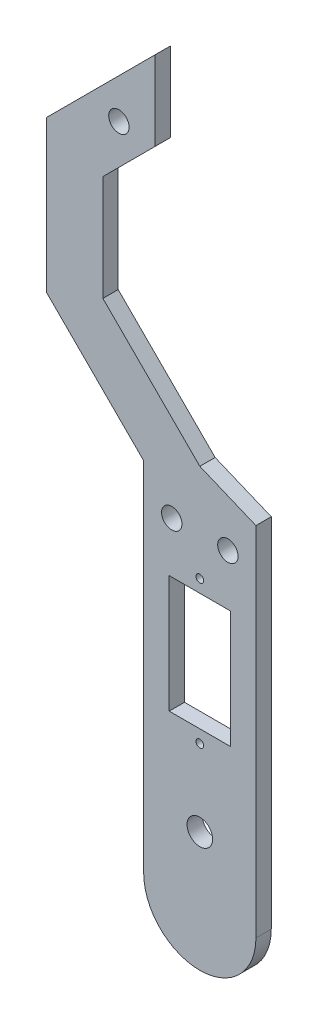
ISO-10303-21;
HEADER;
FILE_DESCRIPTION(('STEP AP214'),'2;1');
FILE_NAME('part.step','',(''),(''),'','','');
FILE_SCHEMA(('AUTOMOTIVE_DESIGN { 1 0 10303 214 1 1 1 1 }'));
ENDSEC;
DATA;
#1=APPLICATION_CONTEXT('core data for automotive mechanical design processes');
#2=APPLICATION_PROTOCOL_DEFINITION('international standard','automotive_design',2000,#1);
#3=PRODUCT_CONTEXT('',#1,'mechanical');
#4=PRODUCT('Part','Part','',(#3));
#5=PRODUCT_RELATED_PRODUCT_CATEGORY('part','',(#4));
#6=PRODUCT_DEFINITION_FORMATION('','',#4);
#7=PRODUCT_DEFINITION_CONTEXT('part definition',#1,'design');
#8=PRODUCT_DEFINITION('design','',#6,#7);
#9=PRODUCT_DEFINITION_SHAPE('','',#8);
#10=(LENGTH_UNIT() NAMED_UNIT(*) SI_UNIT(.MILLI.,.METRE.));
#11=(NAMED_UNIT(*) PLANE_ANGLE_UNIT() SI_UNIT($,.RADIAN.));
#12=(NAMED_UNIT(*) SI_UNIT($,.STERADIAN.) SOLID_ANGLE_UNIT());
#13=UNCERTAINTY_MEASURE_WITH_UNIT(LENGTH_MEASURE(1.E-05),#10,'distance_accuracy_value','');
#14=(GEOMETRIC_REPRESENTATION_CONTEXT(3) GLOBAL_UNCERTAINTY_ASSIGNED_CONTEXT((#13)) GLOBAL_UNIT_ASSIGNED_CONTEXT((#10,
#11,#12)) REPRESENTATION_CONTEXT('',''));
#15=CARTESIAN_POINT('',(0.,0.,0.));
#16=DIRECTION('',(0.,0.,1.));
#17=DIRECTION('',(1.,0.,0.));
#18=AXIS2_PLACEMENT_3D('',#15,#16,#17);
#19=CARTESIAN_POINT('',(11.,0.,3.));
#20=DIRECTION('',(0.,0.,1.));
#21=DIRECTION('',(1.,0.,0.));
#22=AXIS2_PLACEMENT_3D('',#19,#20,#21);
#23=PLANE('',#22);
#24=CARTESIAN_POINT('',(11.,12.5,3.));
#25=DIRECTION('',(0.,0.,1.));
#26=DIRECTION('',(1.,0.,0.));
#27=AXIS2_PLACEMENT_3D('',#24,#25,#26);
#28=CIRCLE('',#27,2.5);
#29=CARTESIAN_POINT('',(13.5,12.5,3.));
#30=VERTEX_POINT('',#29);
#31=EDGE_CURVE('E470',#30,#30,#28,.T.);
#32=ORIENTED_EDGE('',*,*,#31,.F.);
#33=EDGE_LOOP('',(#32));
#34=FACE_BOUND('',#33,.T.);
#35=CARTESIAN_POINT('',(11.,27.5,3.));
#36=DIRECTION('',(0.,0.,1.));
#37=DIRECTION('',(1.,0.,0.));
#38=AXIS2_PLACEMENT_3D('',#35,#36,#37);
#39=CIRCLE('',#38,0.75);
#40=CARTESIAN_POINT('',(11.75,27.5,3.));
#41=VERTEX_POINT('',#40);
#42=EDGE_CURVE('E479',#41,#41,#39,.T.);
#43=ORIENTED_EDGE('',*,*,#42,.F.);
#44=EDGE_LOOP('',(#43));
#45=FACE_BOUND('',#44,.T.);
#46=CARTESIAN_POINT('',(11.,55.5,3.));
#47=DIRECTION('',(0.,0.,1.));
#48=DIRECTION('',(1.,0.,0.));
#49=AXIS2_PLACEMENT_3D('',#46,#47,#48);
#50=CIRCLE('',#49,0.75);
#51=CARTESIAN_POINT('',(11.75,55.5,3.));
#52=VERTEX_POINT('',#51);
#53=EDGE_CURVE('E190',#52,#52,#50,.T.);
#54=ORIENTED_EDGE('',*,*,#53,.F.);
#55=EDGE_LOOP('',(#54));
#56=FACE_BOUND('',#55,.T.);
#57=DIRECTION('',(1.,0.,0.));
#58=VECTOR('',#57,1.);
#59=CARTESIAN_POINT('',(5.,53.,3.));
#60=LINE('',#59,#58);
#61=CARTESIAN_POINT('',(5.,53.,3.));
#62=VERTEX_POINT('',#61);
#63=CARTESIAN_POINT('',(17.,53.,3.));
#64=VERTEX_POINT('',#63);
#65=EDGE_CURVE('E157',#62,#64,#60,.T.);
#66=ORIENTED_EDGE('',*,*,#65,.T.);
#67=DIRECTION('',(0.,-1.,0.));
#68=VECTOR('',#67,1.);
#69=CARTESIAN_POINT('',(17.,53.,3.));
#70=LINE('',#69,#68);
#71=CARTESIAN_POINT('',(17.,30.,3.));
#72=VERTEX_POINT('',#71);
#73=EDGE_CURVE('E164',#64,#72,#70,.T.);
#74=ORIENTED_EDGE('',*,*,#73,.T.);
#75=DIRECTION('',(1.,0.,0.));
#76=VECTOR('',#75,1.);
#77=CARTESIAN_POINT('',(5.,30.,3.));
#78=LINE('',#77,#76);
#79=CARTESIAN_POINT('',(5.,30.,3.));
#80=VERTEX_POINT('',#79);
#81=EDGE_CURVE('E169',#80,#72,#78,.T.);
#82=ORIENTED_EDGE('',*,*,#81,.F.);
#83=DIRECTION('',(0.,-1.,0.));
#84=VECTOR('',#83,1.);
#85=CARTESIAN_POINT('',(5.,53.,3.));
#86=LINE('',#85,#84);
#87=EDGE_CURVE('E161',#62,#80,#86,.T.);
#88=ORIENTED_EDGE('',*,*,#87,.F.);
#89=EDGE_LOOP('',(#66,#74,#82,#88));
#90=FACE_BOUND('',#89,.T.);
#91=CARTESIAN_POINT('',(-4.85786437626912,125.150757595082,3.));
#92=DIRECTION('',(0.,0.,1.));
#93=DIRECTION('',(1.,0.,0.));
#94=AXIS2_PLACEMENT_3D('',#91,#92,#93);
#95=CIRCLE('',#94,2.00000000000002);
#96=CARTESIAN_POINT('',(-2.8578643762691,125.150757595082,3.));
#97=VERTEX_POINT('',#96);
#98=EDGE_CURVE('E205',#97,#97,#95,.T.);
#99=ORIENTED_EDGE('',*,*,#98,.F.);
#100=EDGE_LOOP('',(#99));
#101=FACE_BOUND('',#100,.T.);
#102=CARTESIAN_POINT('',(11.,0.,3.));
#103=DIRECTION('',(0.,0.,1.));
#104=DIRECTION('',(1.,0.,0.));
#105=AXIS2_PLACEMENT_3D('',#102,#103,#104);
#106=CIRCLE('',#105,11.);
#107=CARTESIAN_POINT('',(0.,0.,3.));
#108=VERTEX_POINT('',#107);
#109=CARTESIAN_POINT('',(22.,0.,3.));
#110=VERTEX_POINT('',#109);
#111=EDGE_CURVE('E221',#108,#110,#106,.T.);
#112=ORIENTED_EDGE('',*,*,#111,.T.);
#113=DIRECTION('',(0.,1.,0.));
#114=VECTOR('',#113,1.);
#115=CARTESIAN_POINT('',(22.,0.,3.));
#116=LINE('',#115,#114);
#117=CARTESIAN_POINT('',(22.,70.,3.));
#118=VERTEX_POINT('',#117);
#119=EDGE_CURVE('E225',#110,#118,#116,.T.);
#120=ORIENTED_EDGE('',*,*,#119,.T.);
#121=DIRECTION('',(0.923879532511286,-0.382683432365092,0.));
#122=VECTOR('',#121,1.);
#123=CARTESIAN_POINT('',(11.,74.5563491861041,3.));
#124=LINE('',#123,#122);
#125=CARTESIAN_POINT('',(11.,74.5563491861041,3.));
#126=VERTEX_POINT('',#125);
#127=EDGE_CURVE('E229',#126,#118,#124,.T.);
#128=ORIENTED_EDGE('',*,*,#127,.F.);
#129=DIRECTION('',(-0.707106781186552,0.707106781186543,0.));
#130=VECTOR('',#129,1.);
#131=CARTESIAN_POINT('',(11.,74.5563491861041,3.));
#132=LINE('',#131,#130);
#133=CARTESIAN_POINT('',(-7.99999999999999,93.5563491861038,3.));
#134=VERTEX_POINT('',#133);
#135=EDGE_CURVE('E233',#126,#134,#132,.T.);
#136=ORIENTED_EDGE('',*,*,#135,.T.);
#137=DIRECTION('',(0.,1.,0.));
#138=VECTOR('',#137,1.);
#139=CARTESIAN_POINT('',(-7.99999999999999,93.5563491861038,3.));
#140=LINE('',#139,#138);
#141=CARTESIAN_POINT('',(-7.99999999999999,114.230447378299,3.));
#142=VERTEX_POINT('',#141);
#143=EDGE_CURVE('E236',#134,#142,#140,.T.);
#144=ORIENTED_EDGE('',*,*,#143,.T.);
#145=DIRECTION('',(-0.707106781186543,-0.707106781186552,0.));
#146=VECTOR('',#145,1.);
#147=CARTESIAN_POINT('',(2.21320343559631,124.443650813896,3.));
#148=LINE('',#147,#146);
#149=CARTESIAN_POINT('',(2.21320343559631,124.443650813896,3.));
#150=VERTEX_POINT('',#149);
#151=EDGE_CURVE('E239',#150,#142,#148,.T.);
#152=ORIENTED_EDGE('',*,*,#151,.F.);
#153=DIRECTION('',(0.,-1.,0.));
#154=VECTOR('',#153,1.);
#155=CARTESIAN_POINT('',(2.21320343559631,140.,3.));
#156=LINE('',#155,#154);
#157=CARTESIAN_POINT('',(2.21320343559631,140.,3.));
#158=VERTEX_POINT('',#157);
#159=EDGE_CURVE('E243',#158,#150,#156,.T.);
#160=ORIENTED_EDGE('',*,*,#159,.F.);
#161=DIRECTION('',(0.707106781186543,0.707106781186552,0.));
#162=VECTOR('',#161,1.);
#163=CARTESIAN_POINT('',(-19.,118.786796564403,3.));
#164=LINE('',#163,#162);
#165=CARTESIAN_POINT('',(-19.,118.786796564403,3.));
#166=VERTEX_POINT('',#165);
#167=EDGE_CURVE('E247',#166,#158,#164,.T.);
#168=ORIENTED_EDGE('',*,*,#167,.F.);
#169=DIRECTION('',(0.,1.,0.));
#170=VECTOR('',#169,1.);
#171=CARTESIAN_POINT('',(-19.,88.9999999999998,3.));
#172=LINE('',#171,#170);
#173=CARTESIAN_POINT('',(-19.,88.9999999999998,3.));
#174=VERTEX_POINT('',#173);
#175=EDGE_CURVE('E251',#174,#166,#172,.T.);
#176=ORIENTED_EDGE('',*,*,#175,.F.);
#177=DIRECTION('',(-0.707106781186552,0.707106781186543,0.));
#178=VECTOR('',#177,1.);
#179=CARTESIAN_POINT('',(0.,70.,3.));
#180=LINE('',#179,#178);
#181=CARTESIAN_POINT('',(0.,70.,3.));
#182=VERTEX_POINT('',#181);
#183=EDGE_CURVE('E255',#182,#174,#180,.T.);
#184=ORIENTED_EDGE('',*,*,#183,.F.);
#185=DIRECTION('',(0.,1.,0.));
#186=VECTOR('',#185,1.);
#187=CARTESIAN_POINT('',(0.,0.,3.));
#188=LINE('',#187,#186);
#189=EDGE_CURVE('E259',#108,#182,#188,.T.);
#190=ORIENTED_EDGE('',*,*,#189,.F.);
#191=EDGE_LOOP('',(#112,#120,#128,#136,#144,#152,#160,#168,#176,#184,#190));
#192=FACE_BOUND('',#191,.T.);
#193=CARTESIAN_POINT('',(16.5,63.,3.));
#194=DIRECTION('',(0.,0.,1.));
#195=DIRECTION('',(1.,0.,0.));
#196=AXIS2_PLACEMENT_3D('',#193,#194,#195);
#197=CIRCLE('',#196,2.);
#198=CARTESIAN_POINT('',(18.5,63.,3.));
#199=VERTEX_POINT('',#198);
#200=EDGE_CURVE('E209',#199,#199,#197,.T.);
#201=ORIENTED_EDGE('',*,*,#200,.F.);
#202=EDGE_LOOP('',(#201));
#203=FACE_BOUND('',#202,.T.);
#204=CARTESIAN_POINT('',(5.5,63.,3.));
#205=DIRECTION('',(0.,0.,-1.));
#206=DIRECTION('',(-1.,0.,0.));
#207=AXIS2_PLACEMENT_3D('',#204,#205,#206);
#208=CIRCLE('',#207,2.);
#209=CARTESIAN_POINT('',(3.5,63.,3.));
#210=VERTEX_POINT('',#209);
#211=EDGE_CURVE('E213',#210,#210,#208,.T.);
#212=ORIENTED_EDGE('',*,*,#211,.T.);
#213=EDGE_LOOP('',(#212));
#214=FACE_BOUND('',#213,.T.);
#215=ADVANCED_FACE('F45',(#34,#45,#56,#90,#101,#192,#203,#214),#23,.T.);
#216=CARTESIAN_POINT('',(11.,0.,0.));
#217=DIRECTION('',(0.,0.,1.));
#218=DIRECTION('',(1.,0.,0.));
#219=AXIS2_PLACEMENT_3D('',#216,#217,#218);
#220=PLANE('',#219);
#221=CARTESIAN_POINT('',(11.,12.5,0.));
#222=DIRECTION('',(0.,0.,1.));
#223=DIRECTION('',(1.,0.,0.));
#224=AXIS2_PLACEMENT_3D('',#221,#222,#223);
#225=CIRCLE('',#224,2.5);
#226=CARTESIAN_POINT('',(13.5,12.5,0.));
#227=VERTEX_POINT('',#226);
#228=EDGE_CURVE('E472',#227,#227,#225,.T.);
#229=ORIENTED_EDGE('',*,*,#228,.T.);
#230=EDGE_LOOP('',(#229));
#231=FACE_BOUND('',#230,.T.);
#232=CARTESIAN_POINT('',(11.,27.5,0.));
#233=DIRECTION('',(0.,0.,1.));
#234=DIRECTION('',(1.,0.,0.));
#235=AXIS2_PLACEMENT_3D('',#232,#233,#234);
#236=CIRCLE('',#235,0.75);
#237=CARTESIAN_POINT('',(11.75,27.5,0.));
#238=VERTEX_POINT('',#237);
#239=EDGE_CURVE('E476',#238,#238,#236,.T.);
#240=ORIENTED_EDGE('',*,*,#239,.T.);
#241=EDGE_LOOP('',(#240));
#242=FACE_BOUND('',#241,.T.);
#243=CARTESIAN_POINT('',(11.,55.5,0.));
#244=DIRECTION('',(0.,0.,1.));
#245=DIRECTION('',(1.,0.,0.));
#246=AXIS2_PLACEMENT_3D('',#243,#244,#245);
#247=CIRCLE('',#246,0.75);
#248=CARTESIAN_POINT('',(11.75,55.5,0.));
#249=VERTEX_POINT('',#248);
#250=EDGE_CURVE('E180',#249,#249,#247,.T.);
#251=ORIENTED_EDGE('',*,*,#250,.T.);
#252=EDGE_LOOP('',(#251));
#253=FACE_BOUND('',#252,.T.);
#254=DIRECTION('',(0.,-1.,0.));
#255=VECTOR('',#254,1.);
#256=CARTESIAN_POINT('',(17.,53.,0.));
#257=LINE('',#256,#255);
#258=CARTESIAN_POINT('',(17.,53.,0.));
#259=VERTEX_POINT('',#258);
#260=CARTESIAN_POINT('',(17.,30.,0.));
#261=VERTEX_POINT('',#260);
#262=EDGE_CURVE('E189',#259,#261,#257,.T.);
#263=ORIENTED_EDGE('',*,*,#262,.F.);
#264=DIRECTION('',(1.,0.,0.));
#265=VECTOR('',#264,1.);
#266=CARTESIAN_POINT('',(5.,53.,0.));
#267=LINE('',#266,#265);
#268=CARTESIAN_POINT('',(5.,53.,0.));
#269=VERTEX_POINT('',#268);
#270=EDGE_CURVE('E71',#269,#259,#267,.T.);
#271=ORIENTED_EDGE('',*,*,#270,.F.);
#272=DIRECTION('',(0.,-1.,0.));
#273=VECTOR('',#272,1.);
#274=CARTESIAN_POINT('',(5.,53.,0.));
#275=LINE('',#274,#273);
#276=CARTESIAN_POINT('',(5.,30.,0.));
#277=VERTEX_POINT('',#276);
#278=EDGE_CURVE('E173',#269,#277,#275,.T.);
#279=ORIENTED_EDGE('',*,*,#278,.T.);
#280=DIRECTION('',(1.,0.,0.));
#281=VECTOR('',#280,1.);
#282=CARTESIAN_POINT('',(5.,30.,0.));
#283=LINE('',#282,#281);
#284=EDGE_CURVE('E177',#277,#261,#283,.T.);
#285=ORIENTED_EDGE('',*,*,#284,.T.);
#286=EDGE_LOOP('',(#263,#271,#279,#285));
#287=FACE_BOUND('',#286,.T.);
#288=CARTESIAN_POINT('',(-4.85786437626912,125.150757595082,0.));
#289=DIRECTION('',(0.,0.,1.));
#290=DIRECTION('',(1.,0.,0.));
#291=AXIS2_PLACEMENT_3D('',#288,#289,#290);
#292=CIRCLE('',#291,2.00000000000002);
#293=CARTESIAN_POINT('',(-2.8578643762691,125.150757595082,0.));
#294=VERTEX_POINT('',#293);
#295=EDGE_CURVE('E199',#294,#294,#292,.T.);
#296=ORIENTED_EDGE('',*,*,#295,.T.);
#297=EDGE_LOOP('',(#296));
#298=FACE_BOUND('',#297,.T.);
#299=CARTESIAN_POINT('',(16.5,63.,0.));
#300=DIRECTION('',(0.,0.,1.));
#301=DIRECTION('',(1.,0.,0.));
#302=AXIS2_PLACEMENT_3D('',#299,#300,#301);
#303=CIRCLE('',#302,2.);
#304=CARTESIAN_POINT('',(18.5,63.,0.));
#305=VERTEX_POINT('',#304);
#306=EDGE_CURVE('E217',#305,#305,#303,.T.);
#307=ORIENTED_EDGE('',*,*,#306,.T.);
#308=EDGE_LOOP('',(#307));
#309=FACE_BOUND('',#308,.T.);
#310=CARTESIAN_POINT('',(11.,0.,0.));
#311=DIRECTION('',(0.,0.,1.));
#312=DIRECTION('',(1.,0.,0.));
#313=AXIS2_PLACEMENT_3D('',#310,#311,#312);
#314=CIRCLE('',#313,11.);
#315=CARTESIAN_POINT('',(0.,0.,0.));
#316=VERTEX_POINT('',#315);
#317=CARTESIAN_POINT('',(22.,0.,0.));
#318=VERTEX_POINT('',#317);
#319=EDGE_CURVE('E264',#316,#318,#314,.T.);
#320=ORIENTED_EDGE('',*,*,#319,.F.);
#321=DIRECTION('',(0.,1.,0.));
#322=VECTOR('',#321,1.);
#323=CARTESIAN_POINT('',(0.,0.,0.));
#324=LINE('',#323,#322);
#325=CARTESIAN_POINT('',(0.,70.,0.));
#326=VERTEX_POINT('',#325);
#327=EDGE_CURVE('E226',#316,#326,#324,.T.);
#328=ORIENTED_EDGE('',*,*,#327,.T.);
#329=DIRECTION('',(-0.707106781186552,0.707106781186543,0.));
#330=VECTOR('',#329,1.);
#331=CARTESIAN_POINT('',(0.,70.,0.));
#332=LINE('',#331,#330);
#333=CARTESIAN_POINT('',(-19.,88.9999999999998,0.));
#334=VERTEX_POINT('',#333);
#335=EDGE_CURVE('E299',#326,#334,#332,.T.);
#336=ORIENTED_EDGE('',*,*,#335,.T.);
#337=DIRECTION('',(0.,1.,0.));
#338=VECTOR('',#337,1.);
#339=CARTESIAN_POINT('',(-19.,88.9999999999998,0.));
#340=LINE('',#339,#338);
#341=CARTESIAN_POINT('',(-19.,118.786796564403,0.));
#342=VERTEX_POINT('',#341);
#343=EDGE_CURVE('E295',#334,#342,#340,.T.);
#344=ORIENTED_EDGE('',*,*,#343,.T.);
#345=DIRECTION('',(0.707106781186543,0.707106781186552,0.));
#346=VECTOR('',#345,1.);
#347=CARTESIAN_POINT('',(-19.,118.786796564403,0.));
#348=LINE('',#347,#346);
#349=CARTESIAN_POINT('',(2.21320343559631,140.,0.));
#350=VERTEX_POINT('',#349);
#351=EDGE_CURVE('E291',#342,#350,#348,.T.);
#352=ORIENTED_EDGE('',*,*,#351,.T.);
#353=DIRECTION('',(0.,-1.,0.));
#354=VECTOR('',#353,1.);
#355=CARTESIAN_POINT('',(2.21320343559631,140.,0.));
#356=LINE('',#355,#354);
#357=CARTESIAN_POINT('',(2.21320343559631,124.443650813896,0.));
#358=VERTEX_POINT('',#357);
#359=EDGE_CURVE('E287',#350,#358,#356,.T.);
#360=ORIENTED_EDGE('',*,*,#359,.T.);
#361=DIRECTION('',(-0.707106781186543,-0.707106781186552,0.));
#362=VECTOR('',#361,1.);
#363=CARTESIAN_POINT('',(2.21320343559631,124.443650813896,0.));
#364=LINE('',#363,#362);
#365=CARTESIAN_POINT('',(-7.99999999999999,114.230447378299,0.));
#366=VERTEX_POINT('',#365);
#367=EDGE_CURVE('E283',#358,#366,#364,.T.);
#368=ORIENTED_EDGE('',*,*,#367,.T.);
#369=DIRECTION('',(0.,1.,0.));
#370=VECTOR('',#369,1.);
#371=CARTESIAN_POINT('',(-7.99999999999999,93.5563491861038,0.));
#372=LINE('',#371,#370);
#373=CARTESIAN_POINT('',(-7.99999999999999,93.5563491861038,0.));
#374=VERTEX_POINT('',#373);
#375=EDGE_CURVE('E279',#374,#366,#372,.T.);
#376=ORIENTED_EDGE('',*,*,#375,.F.);
#377=DIRECTION('',(-0.707106781186552,0.707106781186543,0.));
#378=VECTOR('',#377,1.);
#379=CARTESIAN_POINT('',(11.,74.5563491861041,0.));
#380=LINE('',#379,#378);
#381=CARTESIAN_POINT('',(11.,74.5563491861041,0.));
#382=VERTEX_POINT('',#381);
#383=EDGE_CURVE('E276',#382,#374,#380,.T.);
#384=ORIENTED_EDGE('',*,*,#383,.F.);
#385=DIRECTION('',(0.923879532511286,-0.382683432365092,0.));
#386=VECTOR('',#385,1.);
#387=CARTESIAN_POINT('',(11.,74.5563491861041,0.));
#388=LINE('',#387,#386);
#389=CARTESIAN_POINT('',(22.,70.,0.));
#390=VERTEX_POINT('',#389);
#391=EDGE_CURVE('E272',#382,#390,#388,.T.);
#392=ORIENTED_EDGE('',*,*,#391,.T.);
#393=DIRECTION('',(0.,1.,0.));
#394=VECTOR('',#393,1.);
#395=CARTESIAN_POINT('',(22.,0.,0.));
#396=LINE('',#395,#394);
#397=EDGE_CURVE('E268',#318,#390,#396,.T.);
#398=ORIENTED_EDGE('',*,*,#397,.F.);
#399=EDGE_LOOP('',(#320,#328,#336,#344,#352,#360,#368,#376,#384,#392,#398));
#400=FACE_BOUND('',#399,.T.);
#401=CARTESIAN_POINT('',(5.5,63.,0.));
#402=DIRECTION('',(0.,0.,1.));
#403=DIRECTION('',(1.,0.,0.));
#404=AXIS2_PLACEMENT_3D('',#401,#402,#403);
#405=CIRCLE('',#404,2.);
#406=CARTESIAN_POINT('',(7.5,63.,0.));
#407=VERTEX_POINT('',#406);
#408=EDGE_CURVE('E49',#407,#407,#405,.F.);
#409=ORIENTED_EDGE('',*,*,#408,.F.);
#410=EDGE_LOOP('',(#409));
#411=FACE_BOUND('',#410,.T.);
#412=ADVANCED_FACE('F344',(#231,#242,#253,#287,#298,#309,#400,#411),#220,.F.);
#413=CARTESIAN_POINT('',(11.,0.,3.));
#414=DIRECTION('',(0.,0.,-1.));
#415=DIRECTION('',(-1.,0.,0.));
#416=AXIS2_PLACEMENT_3D('',#413,#414,#415);
#417=CYLINDRICAL_SURFACE('',#416,11.);
#418=ORIENTED_EDGE('',*,*,#319,.T.);
#419=DIRECTION('',(0.,0.,-1.));
#420=VECTOR('',#419,1.);
#421=CARTESIAN_POINT('',(22.,0.,3.));
#422=LINE('',#421,#420);
#423=EDGE_CURVE('E11',#110,#318,#422,.T.);
#424=ORIENTED_EDGE('',*,*,#423,.F.);
#425=ORIENTED_EDGE('',*,*,#111,.F.);
#426=DIRECTION('',(0.,0.,-1.));
#427=VECTOR('',#426,1.);
#428=CARTESIAN_POINT('',(0.,0.,3.));
#429=LINE('',#428,#427);
#430=EDGE_CURVE('E263',#108,#316,#429,.T.);
#431=ORIENTED_EDGE('',*,*,#430,.T.);
#432=EDGE_LOOP('',(#418,#424,#425,#431));
#433=FACE_BOUND('',#432,.T.);
#434=ADVANCED_FACE('F47',(#433),#417,.T.);
#435=CARTESIAN_POINT('',(22.,0.,3.));
#436=DIRECTION('',(-1.,0.,0.));
#437=DIRECTION('',(0.,-1.,0.));
#438=AXIS2_PLACEMENT_3D('',#435,#436,#437);
#439=PLANE('',#438);
#440=ORIENTED_EDGE('',*,*,#397,.T.);
#441=DIRECTION('',(0.,0.,-1.));
#442=VECTOR('',#441,1.);
#443=CARTESIAN_POINT('',(22.,70.,3.));
#444=LINE('',#443,#442);
#445=EDGE_CURVE('E55',#118,#390,#444,.T.);
#446=ORIENTED_EDGE('',*,*,#445,.F.);
#447=ORIENTED_EDGE('',*,*,#119,.F.);
#448=ORIENTED_EDGE('',*,*,#423,.T.);
#449=EDGE_LOOP('',(#440,#446,#447,#448));
#450=FACE_BOUND('',#449,.T.);
#451=ADVANCED_FACE('F352',(#450),#439,.F.);
#452=CARTESIAN_POINT('',(11.,74.5563491861041,3.));
#453=DIRECTION('',(0.382683432365092,0.923879532511286,0.));
#454=DIRECTION('',(-0.923879532511286,0.382683432365092,0.));
#455=AXIS2_PLACEMENT_3D('',#452,#453,#454);
#456=PLANE('',#455);
#457=ORIENTED_EDGE('',*,*,#391,.F.);
#458=DIRECTION('',(0.,0.,-1.));
#459=VECTOR('',#458,1.);
#460=CARTESIAN_POINT('',(11.,74.5563491861041,3.));
#461=LINE('',#460,#459);
#462=EDGE_CURVE('E330',#126,#382,#461,.T.);
#463=ORIENTED_EDGE('',*,*,#462,.F.);
#464=ORIENTED_EDGE('',*,*,#127,.T.);
#465=ORIENTED_EDGE('',*,*,#445,.T.);
#466=EDGE_LOOP('',(#457,#463,#464,#465));
#467=FACE_BOUND('',#466,.T.);
#468=ADVANCED_FACE('F392',(#467),#456,.T.);
#469=CARTESIAN_POINT('',(11.,74.5563491861041,3.));
#470=DIRECTION('',(-0.707106781186543,-0.707106781186552,0.));
#471=DIRECTION('',(0.707106781186552,-0.707106781186543,0.));
#472=AXIS2_PLACEMENT_3D('',#469,#470,#471);
#473=PLANE('',#472);
#474=ORIENTED_EDGE('',*,*,#383,.T.);
#475=DIRECTION('',(0.,0.,-1.));
#476=VECTOR('',#475,1.);
#477=CARTESIAN_POINT('',(-7.99999999999999,93.5563491861038,3.));
#478=LINE('',#477,#476);
#479=EDGE_CURVE('E326',#134,#374,#478,.T.);
#480=ORIENTED_EDGE('',*,*,#479,.F.);
#481=ORIENTED_EDGE('',*,*,#135,.F.);
#482=ORIENTED_EDGE('',*,*,#462,.T.);
#483=EDGE_LOOP('',(#474,#480,#481,#482));
#484=FACE_BOUND('',#483,.T.);
#485=ADVANCED_FACE('F388',(#484),#473,.F.);
#486=CARTESIAN_POINT('',(-7.99999999999999,93.5563491861038,3.));
#487=DIRECTION('',(-1.,0.,0.));
#488=DIRECTION('',(0.,-1.,0.));
#489=AXIS2_PLACEMENT_3D('',#486,#487,#488);
#490=PLANE('',#489);
#491=ORIENTED_EDGE('',*,*,#375,.T.);
#492=DIRECTION('',(0.,0.,-1.));
#493=VECTOR('',#492,1.);
#494=CARTESIAN_POINT('',(-7.99999999999999,114.230447378299,3.));
#495=LINE('',#494,#493);
#496=EDGE_CURVE('E323',#142,#366,#495,.T.);
#497=ORIENTED_EDGE('',*,*,#496,.F.);
#498=ORIENTED_EDGE('',*,*,#143,.F.);
#499=ORIENTED_EDGE('',*,*,#479,.T.);
#500=EDGE_LOOP('',(#491,#497,#498,#499));
#501=FACE_BOUND('',#500,.T.);
#502=ADVANCED_FACE('F384',(#501),#490,.F.);
#503=CARTESIAN_POINT('',(2.21320343559631,124.443650813896,3.));
#504=DIRECTION('',(0.707106781186552,-0.707106781186543,0.));
#505=DIRECTION('',(0.707106781186543,0.707106781186552,0.));
#506=AXIS2_PLACEMENT_3D('',#503,#504,#505);
#507=PLANE('',#506);
#508=ORIENTED_EDGE('',*,*,#367,.F.);
#509=DIRECTION('',(0.,0.,-1.));
#510=VECTOR('',#509,1.);
#511=CARTESIAN_POINT('',(2.21320343559631,124.443650813896,3.));
#512=LINE('',#511,#510);
#513=EDGE_CURVE('E320',#150,#358,#512,.T.);
#514=ORIENTED_EDGE('',*,*,#513,.F.);
#515=ORIENTED_EDGE('',*,*,#151,.T.);
#516=ORIENTED_EDGE('',*,*,#496,.T.);
#517=EDGE_LOOP('',(#508,#514,#515,#516));
#518=FACE_BOUND('',#517,.T.);
#519=ADVANCED_FACE('F380',(#518),#507,.T.);
#520=CARTESIAN_POINT('',(2.21320343559631,140.,3.));
#521=DIRECTION('',(1.,0.,0.));
#522=DIRECTION('',(0.,1.,0.));
#523=AXIS2_PLACEMENT_3D('',#520,#521,#522);
#524=PLANE('',#523);
#525=ORIENTED_EDGE('',*,*,#359,.F.);
#526=DIRECTION('',(0.,0.,-1.));
#527=VECTOR('',#526,1.);
#528=CARTESIAN_POINT('',(2.21320343559631,140.,3.));
#529=LINE('',#528,#527);
#530=EDGE_CURVE('E317',#158,#350,#529,.T.);
#531=ORIENTED_EDGE('',*,*,#530,.F.);
#532=ORIENTED_EDGE('',*,*,#159,.T.);
#533=ORIENTED_EDGE('',*,*,#513,.T.);
#534=EDGE_LOOP('',(#525,#531,#532,#533));
#535=FACE_BOUND('',#534,.T.);
#536=ADVANCED_FACE('F376',(#535),#524,.T.);
#537=CARTESIAN_POINT('',(-19.,118.786796564403,3.));
#538=DIRECTION('',(-0.707106781186552,0.707106781186543,0.));
#539=DIRECTION('',(-0.707106781186543,-0.707106781186552,0.));
#540=AXIS2_PLACEMENT_3D('',#537,#538,#539);
#541=PLANE('',#540);
#542=ORIENTED_EDGE('',*,*,#351,.F.);
#543=DIRECTION('',(0.,0.,-1.));
#544=VECTOR('',#543,1.);
#545=CARTESIAN_POINT('',(-19.,118.786796564403,3.));
#546=LINE('',#545,#544);
#547=EDGE_CURVE('E314',#166,#342,#546,.T.);
#548=ORIENTED_EDGE('',*,*,#547,.F.);
#549=ORIENTED_EDGE('',*,*,#167,.T.);
#550=ORIENTED_EDGE('',*,*,#530,.T.);
#551=EDGE_LOOP('',(#542,#548,#549,#550));
#552=FACE_BOUND('',#551,.T.);
#553=ADVANCED_FACE('F372',(#552),#541,.T.);
#554=CARTESIAN_POINT('',(-19.,88.9999999999998,3.));
#555=DIRECTION('',(-1.,0.,0.));
#556=DIRECTION('',(0.,-1.,0.));
#557=AXIS2_PLACEMENT_3D('',#554,#555,#556);
#558=PLANE('',#557);
#559=ORIENTED_EDGE('',*,*,#343,.F.);
#560=DIRECTION('',(0.,0.,-1.));
#561=VECTOR('',#560,1.);
#562=CARTESIAN_POINT('',(-19.,88.9999999999998,3.));
#563=LINE('',#562,#561);
#564=EDGE_CURVE('E311',#174,#334,#563,.T.);
#565=ORIENTED_EDGE('',*,*,#564,.F.);
#566=ORIENTED_EDGE('',*,*,#175,.T.);
#567=ORIENTED_EDGE('',*,*,#547,.T.);
#568=EDGE_LOOP('',(#559,#565,#566,#567));
#569=FACE_BOUND('',#568,.T.);
#570=ADVANCED_FACE('F368',(#569),#558,.T.);
#571=CARTESIAN_POINT('',(0.,70.,3.));
#572=DIRECTION('',(-0.707106781186543,-0.707106781186552,0.));
#573=DIRECTION('',(0.707106781186552,-0.707106781186543,0.));
#574=AXIS2_PLACEMENT_3D('',#571,#572,#573);
#575=PLANE('',#574);
#576=ORIENTED_EDGE('',*,*,#335,.F.);
#577=DIRECTION('',(0.,0.,-1.));
#578=VECTOR('',#577,1.);
#579=CARTESIAN_POINT('',(0.,70.,3.));
#580=LINE('',#579,#578);
#581=EDGE_CURVE('E308',#182,#326,#580,.T.);
#582=ORIENTED_EDGE('',*,*,#581,.F.);
#583=ORIENTED_EDGE('',*,*,#183,.T.);
#584=ORIENTED_EDGE('',*,*,#564,.T.);
#585=EDGE_LOOP('',(#576,#582,#583,#584));
#586=FACE_BOUND('',#585,.T.);
#587=ADVANCED_FACE('F364',(#586),#575,.T.);
#588=CARTESIAN_POINT('',(0.,0.,3.));
#589=DIRECTION('',(-1.,0.,0.));
#590=DIRECTION('',(0.,-1.,0.));
#591=AXIS2_PLACEMENT_3D('',#588,#589,#590);
#592=PLANE('',#591);
#593=ORIENTED_EDGE('',*,*,#327,.F.);
#594=ORIENTED_EDGE('',*,*,#430,.F.);
#595=ORIENTED_EDGE('',*,*,#189,.T.);
#596=ORIENTED_EDGE('',*,*,#581,.T.);
#597=EDGE_LOOP('',(#593,#594,#595,#596));
#598=FACE_BOUND('',#597,.T.);
#599=ADVANCED_FACE('F360',(#598),#592,.T.);
#600=CARTESIAN_POINT('',(16.5,63.,-11.));
#601=DIRECTION('',(0.,0.,1.));
#602=DIRECTION('',(1.,0.,0.));
#603=AXIS2_PLACEMENT_3D('',#600,#601,#602);
#604=CYLINDRICAL_SURFACE('',#603,2.);
#605=ORIENTED_EDGE('',*,*,#200,.T.);
#606=EDGE_LOOP('',(#605));
#607=FACE_BOUND('',#606,.T.);
#608=ORIENTED_EDGE('',*,*,#306,.F.);
#609=EDGE_LOOP('',(#608));
#610=FACE_BOUND('',#609,.T.);
#611=ADVANCED_FACE('F363',(#607,#610),#604,.F.);
#612=CARTESIAN_POINT('',(5.5,63.,-11.));
#613=DIRECTION('',(0.,0.,1.));
#614=DIRECTION('',(1.,0.,0.));
#615=AXIS2_PLACEMENT_3D('',#612,#613,#614);
#616=CYLINDRICAL_SURFACE('',#615,2.);
#617=ORIENTED_EDGE('',*,*,#211,.F.);
#618=EDGE_LOOP('',(#617));
#619=FACE_BOUND('',#618,.T.);
#620=ORIENTED_EDGE('',*,*,#408,.T.);
#621=EDGE_LOOP('',(#620));
#622=FACE_BOUND('',#621,.T.);
#623=ADVANCED_FACE('F342',(#619,#622),#616,.F.);
#624=CARTESIAN_POINT('',(-4.85786437626912,125.150757595082,3.));
#625=DIRECTION('',(0.,0.,-1.));
#626=DIRECTION('',(-1.,0.,0.));
#627=AXIS2_PLACEMENT_3D('',#624,#625,#626);
#628=CYLINDRICAL_SURFACE('',#627,2.00000000000002);
#629=ORIENTED_EDGE('',*,*,#98,.T.);
#630=EDGE_LOOP('',(#629));
#631=FACE_BOUND('',#630,.T.);
#632=ORIENTED_EDGE('',*,*,#295,.F.);
#633=EDGE_LOOP('',(#632));
#634=FACE_BOUND('',#633,.T.);
#635=ADVANCED_FACE('F432',(#631,#634),#628,.F.);
#636=CARTESIAN_POINT('',(5.,53.,3.));
#637=DIRECTION('',(0.,1.,0.));
#638=DIRECTION('',(0.,0.,1.));
#639=AXIS2_PLACEMENT_3D('',#636,#637,#638);
#640=PLANE('',#639);
#641=ORIENTED_EDGE('',*,*,#270,.T.);
#642=DIRECTION('',(0.,0.,-1.));
#643=VECTOR('',#642,1.);
#644=CARTESIAN_POINT('',(17.,53.,3.));
#645=LINE('',#644,#643);
#646=EDGE_CURVE('E154',#64,#259,#645,.T.);
#647=ORIENTED_EDGE('',*,*,#646,.F.);
#648=ORIENTED_EDGE('',*,*,#65,.F.);
#649=DIRECTION('',(0.,0.,-1.));
#650=VECTOR('',#649,1.);
#651=CARTESIAN_POINT('',(5.,53.,3.));
#652=LINE('',#651,#650);
#653=EDGE_CURVE('E196',#62,#269,#652,.T.);
#654=ORIENTED_EDGE('',*,*,#653,.T.);
#655=EDGE_LOOP('',(#641,#647,#648,#654));
#656=FACE_BOUND('',#655,.T.);
#657=ADVANCED_FACE('F155',(#656),#640,.F.);
#658=CARTESIAN_POINT('',(5.,53.,3.));
#659=DIRECTION('',(1.,0.,0.));
#660=DIRECTION('',(0.,1.,0.));
#661=AXIS2_PLACEMENT_3D('',#658,#659,#660);
#662=PLANE('',#661);
#663=ORIENTED_EDGE('',*,*,#278,.F.);
#664=ORIENTED_EDGE('',*,*,#653,.F.);
#665=ORIENTED_EDGE('',*,*,#87,.T.);
#666=DIRECTION('',(0.,0.,-1.));
#667=VECTOR('',#666,1.);
#668=CARTESIAN_POINT('',(5.,30.,3.));
#669=LINE('',#668,#667);
#670=EDGE_CURVE('E200',#80,#277,#669,.T.);
#671=ORIENTED_EDGE('',*,*,#670,.T.);
#672=EDGE_LOOP('',(#663,#664,#665,#671));
#673=FACE_BOUND('',#672,.T.);
#674=ADVANCED_FACE('F444',(#673),#662,.T.);
#675=CARTESIAN_POINT('',(5.,30.,3.));
#676=DIRECTION('',(0.,1.,0.));
#677=DIRECTION('',(0.,0.,1.));
#678=AXIS2_PLACEMENT_3D('',#675,#676,#677);
#679=PLANE('',#678);
#680=ORIENTED_EDGE('',*,*,#284,.F.);
#681=ORIENTED_EDGE('',*,*,#670,.F.);
#682=ORIENTED_EDGE('',*,*,#81,.T.);
#683=DIRECTION('',(0.,0.,-1.));
#684=VECTOR('',#683,1.);
#685=CARTESIAN_POINT('',(17.,30.,3.));
#686=LINE('',#685,#684);
#687=EDGE_CURVE('E63',#72,#261,#686,.T.);
#688=ORIENTED_EDGE('',*,*,#687,.T.);
#689=EDGE_LOOP('',(#680,#681,#682,#688));
#690=FACE_BOUND('',#689,.T.);
#691=ADVANCED_FACE('F448',(#690),#679,.T.);
#692=CARTESIAN_POINT('',(17.,53.,3.));
#693=DIRECTION('',(1.,0.,0.));
#694=DIRECTION('',(0.,0.,-1.));
#695=AXIS2_PLACEMENT_3D('',#692,#693,#694);
#696=PLANE('',#695);
#697=ORIENTED_EDGE('',*,*,#262,.T.);
#698=ORIENTED_EDGE('',*,*,#687,.F.);
#699=ORIENTED_EDGE('',*,*,#73,.F.);
#700=ORIENTED_EDGE('',*,*,#646,.T.);
#701=EDGE_LOOP('',(#697,#698,#699,#700));
#702=FACE_BOUND('',#701,.T.);
#703=ADVANCED_FACE('F165',(#702),#696,.F.);
#704=CARTESIAN_POINT('',(11.,55.5,3.));
#705=DIRECTION('',(0.,0.,-1.));
#706=DIRECTION('',(-1.,0.,0.));
#707=AXIS2_PLACEMENT_3D('',#704,#705,#706);
#708=CYLINDRICAL_SURFACE('',#707,0.75);
#709=ORIENTED_EDGE('',*,*,#53,.T.);
#710=EDGE_LOOP('',(#709));
#711=FACE_BOUND('',#710,.T.);
#712=ORIENTED_EDGE('',*,*,#250,.F.);
#713=EDGE_LOOP('',(#712));
#714=FACE_BOUND('',#713,.T.);
#715=ADVANCED_FACE('F447',(#711,#714),#708,.F.);
#716=CARTESIAN_POINT('',(11.,27.5,3.));
#717=DIRECTION('',(0.,0.,-1.));
#718=DIRECTION('',(-1.,0.,0.));
#719=AXIS2_PLACEMENT_3D('',#716,#717,#718);
#720=CYLINDRICAL_SURFACE('',#719,0.75);
#721=ORIENTED_EDGE('',*,*,#42,.T.);
#722=EDGE_LOOP('',(#721));
#723=FACE_BOUND('',#722,.T.);
#724=ORIENTED_EDGE('',*,*,#239,.F.);
#725=EDGE_LOOP('',(#724));
#726=FACE_BOUND('',#725,.T.);
#727=ADVANCED_FACE('F457',(#723,#726),#720,.F.);
#728=CARTESIAN_POINT('',(11.,12.5,3.));
#729=DIRECTION('',(0.,0.,-1.));
#730=DIRECTION('',(-1.,0.,0.));
#731=AXIS2_PLACEMENT_3D('',#728,#729,#730);
#732=CYLINDRICAL_SURFACE('',#731,2.5);
#733=ORIENTED_EDGE('',*,*,#31,.T.);
#734=EDGE_LOOP('',(#733));
#735=FACE_BOUND('',#734,.T.);
#736=ORIENTED_EDGE('',*,*,#228,.F.);
#737=EDGE_LOOP('',(#736));
#738=FACE_BOUND('',#737,.T.);
#739=ADVANCED_FACE('F461',(#735,#738),#732,.F.);
#740=CLOSED_SHELL('',(#215,#412,#434,#451,#468,#485,#502,#519,#536,#553,#570,#587,#599,#611,
#623,#635,#657,#674,#691,#703,#715,#727,#739));
#741=MANIFOLD_SOLID_BREP('B2',#740);
#742=ADVANCED_BREP_SHAPE_REPRESENTATION('',(#18,#741),#14);
#743=SHAPE_DEFINITION_REPRESENTATION(#9,#742);
ENDSEC;
END-ISO-10303-21;
